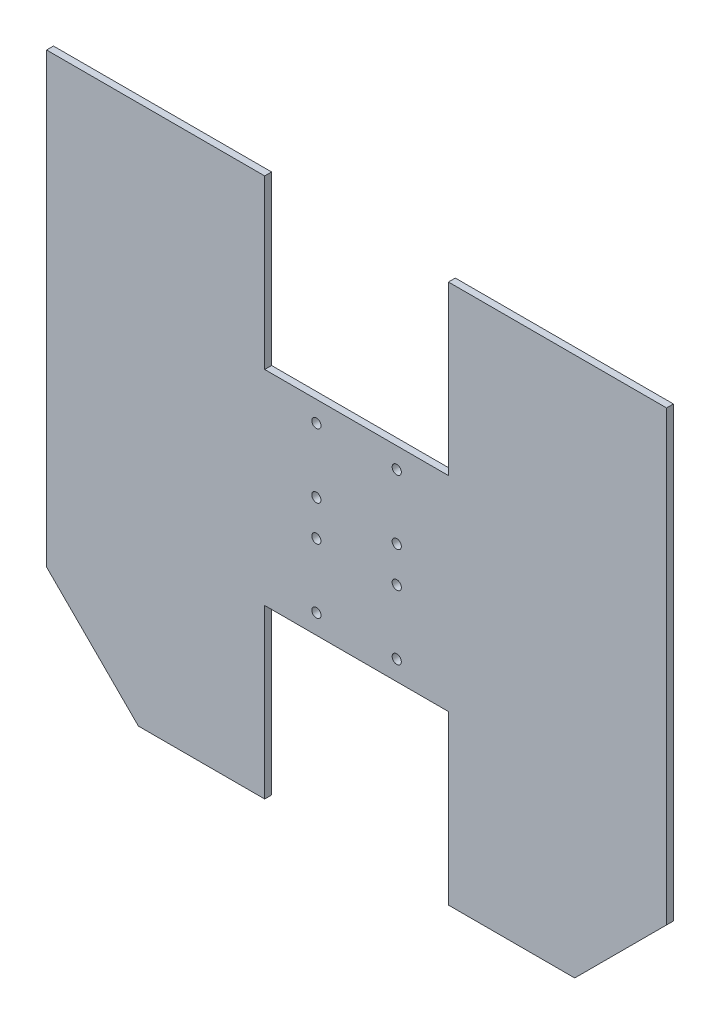
ISO-10303-21;
HEADER;
FILE_DESCRIPTION(('STEP AP214'),'2;1');
FILE_NAME('part.step','',(''),(''),'','','');
FILE_SCHEMA(('AUTOMOTIVE_DESIGN { 1 0 10303 214 1 1 1 1 }'));
ENDSEC;
DATA;
#1=APPLICATION_CONTEXT('core data for automotive mechanical design processes');
#2=APPLICATION_PROTOCOL_DEFINITION('international standard','automotive_design',2000,#1);
#3=PRODUCT_CONTEXT('',#1,'mechanical');
#4=PRODUCT('Part','Part','',(#3));
#5=PRODUCT_RELATED_PRODUCT_CATEGORY('part','',(#4));
#6=PRODUCT_DEFINITION_FORMATION('','',#4);
#7=PRODUCT_DEFINITION_CONTEXT('part definition',#1,'design');
#8=PRODUCT_DEFINITION('design','',#6,#7);
#9=PRODUCT_DEFINITION_SHAPE('','',#8);
#10=(LENGTH_UNIT() NAMED_UNIT(*) SI_UNIT(.MILLI.,.METRE.));
#11=(NAMED_UNIT(*) PLANE_ANGLE_UNIT() SI_UNIT($,.RADIAN.));
#12=(NAMED_UNIT(*) SI_UNIT($,.STERADIAN.) SOLID_ANGLE_UNIT());
#13=UNCERTAINTY_MEASURE_WITH_UNIT(LENGTH_MEASURE(1.E-05),#10,'distance_accuracy_value','');
#14=(GEOMETRIC_REPRESENTATION_CONTEXT(3) GLOBAL_UNCERTAINTY_ASSIGNED_CONTEXT((#13)) GLOBAL_UNIT_ASSIGNED_CONTEXT((#10,
#11,#12)) REPRESENTATION_CONTEXT('',''));
#15=CARTESIAN_POINT('',(0.,0.,0.));
#16=DIRECTION('',(0.,0.,1.));
#17=DIRECTION('',(1.,0.,0.));
#18=AXIS2_PLACEMENT_3D('',#15,#16,#17);
#19=CARTESIAN_POINT('',(-135.,117.5,3.));
#20=DIRECTION('',(0.,-1.,0.));
#21=DIRECTION('',(1.,0.,0.));
#22=AXIS2_PLACEMENT_3D('',#19,#20,#21);
#23=PLANE('',#22);
#24=DIRECTION('',(-1.,0.,0.));
#25=VECTOR('',#24,1.);
#26=CARTESIAN_POINT('',(-135.,117.5,0.));
#27=LINE('',#26,#25);
#28=CARTESIAN_POINT('',(-40.0000000000001,117.5,0.));
#29=VERTEX_POINT('',#28);
#30=CARTESIAN_POINT('',(-135.,117.5,0.));
#31=VERTEX_POINT('',#30);
#32=EDGE_CURVE('E154',#29,#31,#27,.T.);
#33=ORIENTED_EDGE('',*,*,#32,.T.);
#34=DIRECTION('',(0.,0.,-1.));
#35=VECTOR('',#34,1.);
#36=CARTESIAN_POINT('',(-135.,117.5,3.));
#37=LINE('',#36,#35);
#38=CARTESIAN_POINT('',(-135.,117.5,3.));
#39=VERTEX_POINT('',#38);
#40=EDGE_CURVE('E138',#39,#31,#37,.T.);
#41=ORIENTED_EDGE('',*,*,#40,.F.);
#42=DIRECTION('',(-1.,0.,0.));
#43=VECTOR('',#42,1.);
#44=CARTESIAN_POINT('',(-135.,117.5,3.));
#45=LINE('',#44,#43);
#46=CARTESIAN_POINT('',(-40.0000000000001,117.5,3.));
#47=VERTEX_POINT('',#46);
#48=EDGE_CURVE('E141',#47,#39,#45,.T.);
#49=ORIENTED_EDGE('',*,*,#48,.F.);
#50=DIRECTION('',(0.,0.,-1.));
#51=VECTOR('',#50,1.);
#52=CARTESIAN_POINT('',(-40.0000000000001,117.5,3.));
#53=LINE('',#52,#51);
#54=EDGE_CURVE('E209',#47,#29,#53,.T.);
#55=ORIENTED_EDGE('',*,*,#54,.T.);
#56=EDGE_LOOP('',(#33,#41,#49,#55));
#57=FACE_BOUND('',#56,.T.);
#58=ADVANCED_FACE('F35',(#57),#23,.F.);
#59=CARTESIAN_POINT('',(-135.,-117.5,3.));
#60=DIRECTION('',(1.,0.,0.));
#61=DIRECTION('',(0.,0.,-1.));
#62=AXIS2_PLACEMENT_3D('',#59,#60,#61);
#63=PLANE('',#62);
#64=DIRECTION('',(0.,-1.,0.));
#65=VECTOR('',#64,1.);
#66=CARTESIAN_POINT('',(-135.,-117.5,0.));
#67=LINE('',#66,#65);
#68=CARTESIAN_POINT('',(-135.,-77.4999999999998,0.));
#69=VERTEX_POINT('',#68);
#70=EDGE_CURVE('E187',#31,#69,#67,.T.);
#71=ORIENTED_EDGE('',*,*,#70,.T.);
#72=DIRECTION('',(0.,0.,1.));
#73=VECTOR('',#72,1.);
#74=CARTESIAN_POINT('',(-135.,-77.4999999999998,3.));
#75=LINE('',#74,#73);
#76=CARTESIAN_POINT('',(-135.,-77.4999999999998,3.));
#77=VERTEX_POINT('',#76);
#78=EDGE_CURVE('E11',#69,#77,#75,.T.);
#79=ORIENTED_EDGE('',*,*,#78,.T.);
#80=DIRECTION('',(0.,-1.,0.));
#81=VECTOR('',#80,1.);
#82=CARTESIAN_POINT('',(-135.,-117.5,3.));
#83=LINE('',#82,#81);
#84=EDGE_CURVE('E134',#39,#77,#83,.T.);
#85=ORIENTED_EDGE('',*,*,#84,.F.);
#86=ORIENTED_EDGE('',*,*,#40,.T.);
#87=EDGE_LOOP('',(#71,#79,#85,#86));
#88=FACE_BOUND('',#87,.T.);
#89=ADVANCED_FACE('F136',(#88),#63,.F.);
#90=CARTESIAN_POINT('',(-40.0000000000001,-117.5,3.));
#91=DIRECTION('',(0.,1.,0.));
#92=DIRECTION('',(-1.,0.,0.));
#93=AXIS2_PLACEMENT_3D('',#90,#91,#92);
#94=PLANE('',#93);
#95=DIRECTION('',(1.,0.,0.));
#96=VECTOR('',#95,1.);
#97=CARTESIAN_POINT('',(-40.0000000000001,-117.5,3.));
#98=LINE('',#97,#96);
#99=CARTESIAN_POINT('',(-95.,-117.5,3.));
#100=VERTEX_POINT('',#99);
#101=CARTESIAN_POINT('',(-40.0000000000001,-117.5,3.));
#102=VERTEX_POINT('',#101);
#103=EDGE_CURVE('E140',#100,#102,#98,.T.);
#104=ORIENTED_EDGE('',*,*,#103,.F.);
#105=DIRECTION('',(0.,0.,-1.));
#106=VECTOR('',#105,1.);
#107=CARTESIAN_POINT('',(-95.,-117.5,3.));
#108=LINE('',#107,#106);
#109=CARTESIAN_POINT('',(-95.,-117.5,0.));
#110=VERTEX_POINT('',#109);
#111=EDGE_CURVE('E44',#100,#110,#108,.T.);
#112=ORIENTED_EDGE('',*,*,#111,.T.);
#113=DIRECTION('',(1.,0.,0.));
#114=VECTOR('',#113,1.);
#115=CARTESIAN_POINT('',(-40.0000000000001,-117.5,0.));
#116=LINE('',#115,#114);
#117=CARTESIAN_POINT('',(-40.0000000000001,-117.5,0.));
#118=VERTEX_POINT('',#117);
#119=EDGE_CURVE('E179',#110,#118,#116,.T.);
#120=ORIENTED_EDGE('',*,*,#119,.T.);
#121=DIRECTION('',(0.,0.,-1.));
#122=VECTOR('',#121,1.);
#123=CARTESIAN_POINT('',(-40.0000000000001,-117.5,3.));
#124=LINE('',#123,#122);
#125=EDGE_CURVE('E156',#102,#118,#124,.T.);
#126=ORIENTED_EDGE('',*,*,#125,.F.);
#127=EDGE_LOOP('',(#104,#112,#120,#126));
#128=FACE_BOUND('',#127,.T.);
#129=ADVANCED_FACE('F177',(#128),#94,.F.);
#130=CARTESIAN_POINT('',(-40.0000000000001,-117.5,3.));
#131=DIRECTION('',(-1.,0.,0.));
#132=DIRECTION('',(0.,-1.,0.));
#133=AXIS2_PLACEMENT_3D('',#130,#131,#132);
#134=PLANE('',#133);
#135=DIRECTION('',(0.,1.,0.));
#136=VECTOR('',#135,1.);
#137=CARTESIAN_POINT('',(-40.0000000000001,-117.5,0.));
#138=LINE('',#137,#136);
#139=CARTESIAN_POINT('',(-39.9999999999999,-44.5,0.));
#140=VERTEX_POINT('',#139);
#141=EDGE_CURVE('E186',#118,#140,#138,.T.);
#142=ORIENTED_EDGE('',*,*,#141,.T.);
#143=DIRECTION('',(0.,0.,-1.));
#144=VECTOR('',#143,1.);
#145=CARTESIAN_POINT('',(-39.9999999999999,-44.5,3.));
#146=LINE('',#145,#144);
#147=CARTESIAN_POINT('',(-39.9999999999999,-44.5,3.));
#148=VERTEX_POINT('',#147);
#149=EDGE_CURVE('E162',#148,#140,#146,.T.);
#150=ORIENTED_EDGE('',*,*,#149,.F.);
#151=DIRECTION('',(0.,1.,0.));
#152=VECTOR('',#151,1.);
#153=CARTESIAN_POINT('',(-40.0000000000001,-117.5,3.));
#154=LINE('',#153,#152);
#155=EDGE_CURVE('E276',#102,#148,#154,.T.);
#156=ORIENTED_EDGE('',*,*,#155,.F.);
#157=ORIENTED_EDGE('',*,*,#125,.T.);
#158=EDGE_LOOP('',(#142,#150,#156,#157));
#159=FACE_BOUND('',#158,.T.);
#160=ADVANCED_FACE('F277',(#159),#134,.F.);
#161=CARTESIAN_POINT('',(-39.9999999999999,-44.5,3.));
#162=DIRECTION('',(0.,1.,0.));
#163=DIRECTION('',(0.,0.,1.));
#164=AXIS2_PLACEMENT_3D('',#161,#162,#163);
#165=PLANE('',#164);
#166=DIRECTION('',(1.,0.,0.));
#167=VECTOR('',#166,1.);
#168=CARTESIAN_POINT('',(-39.9999999999999,-44.5,0.));
#169=LINE('',#168,#167);
#170=CARTESIAN_POINT('',(39.9999999999999,-44.5,0.));
#171=VERTEX_POINT('',#170);
#172=EDGE_CURVE('E189',#140,#171,#169,.T.);
#173=ORIENTED_EDGE('',*,*,#172,.T.);
#174=DIRECTION('',(0.,0.,-1.));
#175=VECTOR('',#174,1.);
#176=CARTESIAN_POINT('',(39.9999999999999,-44.5,3.));
#177=LINE('',#176,#175);
#178=CARTESIAN_POINT('',(39.9999999999999,-44.5,3.));
#179=VERTEX_POINT('',#178);
#180=EDGE_CURVE('E226',#179,#171,#177,.T.);
#181=ORIENTED_EDGE('',*,*,#180,.F.);
#182=DIRECTION('',(1.,0.,0.));
#183=VECTOR('',#182,1.);
#184=CARTESIAN_POINT('',(-39.9999999999999,-44.5,3.));
#185=LINE('',#184,#183);
#186=EDGE_CURVE('E234',#148,#179,#185,.T.);
#187=ORIENTED_EDGE('',*,*,#186,.F.);
#188=ORIENTED_EDGE('',*,*,#149,.T.);
#189=EDGE_LOOP('',(#173,#181,#187,#188));
#190=FACE_BOUND('',#189,.T.);
#191=ADVANCED_FACE('F232',(#190),#165,.F.);
#192=CARTESIAN_POINT('',(39.9999999999999,-44.5,3.));
#193=DIRECTION('',(1.,0.,0.));
#194=DIRECTION('',(0.,1.,0.));
#195=AXIS2_PLACEMENT_3D('',#192,#193,#194);
#196=PLANE('',#195);
#197=DIRECTION('',(0.,-1.,0.));
#198=VECTOR('',#197,1.);
#199=CARTESIAN_POINT('',(39.9999999999999,-44.5,0.));
#200=LINE('',#199,#198);
#201=CARTESIAN_POINT('',(40.0000000000001,-117.5,0.));
#202=VERTEX_POINT('',#201);
#203=EDGE_CURVE('E195',#171,#202,#200,.T.);
#204=ORIENTED_EDGE('',*,*,#203,.T.);
#205=DIRECTION('',(0.,0.,-1.));
#206=VECTOR('',#205,1.);
#207=CARTESIAN_POINT('',(40.0000000000001,-117.5,3.));
#208=LINE('',#207,#206);
#209=CARTESIAN_POINT('',(40.0000000000001,-117.5,3.));
#210=VERTEX_POINT('',#209);
#211=EDGE_CURVE('E223',#210,#202,#208,.T.);
#212=ORIENTED_EDGE('',*,*,#211,.F.);
#213=DIRECTION('',(0.,-1.,0.));
#214=VECTOR('',#213,1.);
#215=CARTESIAN_POINT('',(39.9999999999999,-44.5,3.));
#216=LINE('',#215,#214);
#217=EDGE_CURVE('E250',#179,#210,#216,.T.);
#218=ORIENTED_EDGE('',*,*,#217,.F.);
#219=ORIENTED_EDGE('',*,*,#180,.T.);
#220=EDGE_LOOP('',(#204,#212,#218,#219));
#221=FACE_BOUND('',#220,.T.);
#222=ADVANCED_FACE('F241',(#221),#196,.F.);
#223=CARTESIAN_POINT('',(135.,-117.5,3.));
#224=DIRECTION('',(0.,1.,0.));
#225=DIRECTION('',(-1.,0.,0.));
#226=AXIS2_PLACEMENT_3D('',#223,#224,#225);
#227=PLANE('',#226);
#228=DIRECTION('',(1.,0.,0.));
#229=VECTOR('',#228,1.);
#230=CARTESIAN_POINT('',(135.,-117.5,0.));
#231=LINE('',#230,#229);
#232=CARTESIAN_POINT('',(94.9999999999997,-117.5,0.));
#233=VERTEX_POINT('',#232);
#234=EDGE_CURVE('E197',#202,#233,#231,.T.);
#235=ORIENTED_EDGE('',*,*,#234,.T.);
#236=DIRECTION('',(0.,0.,1.));
#237=VECTOR('',#236,1.);
#238=CARTESIAN_POINT('',(94.9999999999997,-117.5,3.));
#239=LINE('',#238,#237);
#240=CARTESIAN_POINT('',(94.9999999999997,-117.5,3.));
#241=VERTEX_POINT('',#240);
#242=EDGE_CURVE('E169',#233,#241,#239,.T.);
#243=ORIENTED_EDGE('',*,*,#242,.T.);
#244=DIRECTION('',(1.,0.,0.));
#245=VECTOR('',#244,1.);
#246=CARTESIAN_POINT('',(135.,-117.5,3.));
#247=LINE('',#246,#245);
#248=EDGE_CURVE('E247',#210,#241,#247,.T.);
#249=ORIENTED_EDGE('',*,*,#248,.F.);
#250=ORIENTED_EDGE('',*,*,#211,.T.);
#251=EDGE_LOOP('',(#235,#243,#249,#250));
#252=FACE_BOUND('',#251,.T.);
#253=ADVANCED_FACE('F245',(#252),#227,.F.);
#254=CARTESIAN_POINT('',(135.,-117.5,3.));
#255=DIRECTION('',(-1.,0.,0.));
#256=DIRECTION('',(0.,0.,1.));
#257=AXIS2_PLACEMENT_3D('',#254,#255,#256);
#258=PLANE('',#257);
#259=DIRECTION('',(0.,1.,0.));
#260=VECTOR('',#259,1.);
#261=CARTESIAN_POINT('',(135.,-117.5,3.));
#262=LINE('',#261,#260);
#263=CARTESIAN_POINT('',(135.,-77.4999999999999,3.));
#264=VERTEX_POINT('',#263);
#265=CARTESIAN_POINT('',(135.,117.5,3.));
#266=VERTEX_POINT('',#265);
#267=EDGE_CURVE('E249',#264,#266,#262,.T.);
#268=ORIENTED_EDGE('',*,*,#267,.F.);
#269=DIRECTION('',(0.,0.,-1.));
#270=VECTOR('',#269,1.);
#271=CARTESIAN_POINT('',(135.,-77.4999999999998,3.));
#272=LINE('',#271,#270);
#273=CARTESIAN_POINT('',(135.,-77.4999999999999,0.));
#274=VERTEX_POINT('',#273);
#275=EDGE_CURVE('E155',#264,#274,#272,.T.);
#276=ORIENTED_EDGE('',*,*,#275,.T.);
#277=DIRECTION('',(0.,1.,0.));
#278=VECTOR('',#277,1.);
#279=CARTESIAN_POINT('',(135.,-117.5,0.));
#280=LINE('',#279,#278);
#281=CARTESIAN_POINT('',(135.,117.5,0.));
#282=VERTEX_POINT('',#281);
#283=EDGE_CURVE('E200',#274,#282,#280,.T.);
#284=ORIENTED_EDGE('',*,*,#283,.T.);
#285=DIRECTION('',(0.,0.,-1.));
#286=VECTOR('',#285,1.);
#287=CARTESIAN_POINT('',(135.,117.5,3.));
#288=LINE('',#287,#286);
#289=EDGE_CURVE('E220',#266,#282,#288,.T.);
#290=ORIENTED_EDGE('',*,*,#289,.F.);
#291=EDGE_LOOP('',(#268,#276,#284,#290));
#292=FACE_BOUND('',#291,.T.);
#293=ADVANCED_FACE('F310',(#292),#258,.F.);
#294=CARTESIAN_POINT('',(135.,117.5,3.));
#295=DIRECTION('',(0.,-1.,0.));
#296=DIRECTION('',(1.,0.,0.));
#297=AXIS2_PLACEMENT_3D('',#294,#295,#296);
#298=PLANE('',#297);
#299=DIRECTION('',(-1.,0.,0.));
#300=VECTOR('',#299,1.);
#301=CARTESIAN_POINT('',(135.,117.5,0.));
#302=LINE('',#301,#300);
#303=CARTESIAN_POINT('',(40.0000000000001,117.5,0.));
#304=VERTEX_POINT('',#303);
#305=EDGE_CURVE('E202',#282,#304,#302,.T.);
#306=ORIENTED_EDGE('',*,*,#305,.T.);
#307=DIRECTION('',(0.,0.,-1.));
#308=VECTOR('',#307,1.);
#309=CARTESIAN_POINT('',(40.0000000000001,117.5,3.));
#310=LINE('',#309,#308);
#311=CARTESIAN_POINT('',(40.0000000000001,117.5,3.));
#312=VERTEX_POINT('',#311);
#313=EDGE_CURVE('E217',#312,#304,#310,.T.);
#314=ORIENTED_EDGE('',*,*,#313,.F.);
#315=DIRECTION('',(-1.,0.,0.));
#316=VECTOR('',#315,1.);
#317=CARTESIAN_POINT('',(135.,117.5,3.));
#318=LINE('',#317,#316);
#319=EDGE_CURVE('E252',#266,#312,#318,.T.);
#320=ORIENTED_EDGE('',*,*,#319,.F.);
#321=ORIENTED_EDGE('',*,*,#289,.T.);
#322=EDGE_LOOP('',(#306,#314,#320,#321));
#323=FACE_BOUND('',#322,.T.);
#324=ADVANCED_FACE('F315',(#323),#298,.F.);
#325=CARTESIAN_POINT('',(40.0000000000001,44.5,3.));
#326=DIRECTION('',(1.,0.,0.));
#327=DIRECTION('',(0.,1.,0.));
#328=AXIS2_PLACEMENT_3D('',#325,#326,#327);
#329=PLANE('',#328);
#330=DIRECTION('',(0.,-1.,0.));
#331=VECTOR('',#330,1.);
#332=CARTESIAN_POINT('',(40.0000000000001,44.5,0.));
#333=LINE('',#332,#331);
#334=CARTESIAN_POINT('',(40.0000000000001,44.5,0.));
#335=VERTEX_POINT('',#334);
#336=EDGE_CURVE('E204',#304,#335,#333,.T.);
#337=ORIENTED_EDGE('',*,*,#336,.T.);
#338=DIRECTION('',(0.,0.,-1.));
#339=VECTOR('',#338,1.);
#340=CARTESIAN_POINT('',(40.0000000000001,44.5,3.));
#341=LINE('',#340,#339);
#342=CARTESIAN_POINT('',(40.0000000000001,44.5,3.));
#343=VERTEX_POINT('',#342);
#344=EDGE_CURVE('E214',#343,#335,#341,.T.);
#345=ORIENTED_EDGE('',*,*,#344,.F.);
#346=DIRECTION('',(0.,-1.,0.));
#347=VECTOR('',#346,1.);
#348=CARTESIAN_POINT('',(40.0000000000001,44.5,3.));
#349=LINE('',#348,#347);
#350=EDGE_CURVE('E258',#312,#343,#349,.T.);
#351=ORIENTED_EDGE('',*,*,#350,.F.);
#352=ORIENTED_EDGE('',*,*,#313,.T.);
#353=EDGE_LOOP('',(#337,#345,#351,#352));
#354=FACE_BOUND('',#353,.T.);
#355=ADVANCED_FACE('F321',(#354),#329,.F.);
#356=CARTESIAN_POINT('',(-39.9999999999999,44.5,3.));
#357=DIRECTION('',(0.,-1.,0.));
#358=DIRECTION('',(1.,0.,0.));
#359=AXIS2_PLACEMENT_3D('',#356,#357,#358);
#360=PLANE('',#359);
#361=DIRECTION('',(-1.,0.,0.));
#362=VECTOR('',#361,1.);
#363=CARTESIAN_POINT('',(-39.9999999999999,44.5,0.));
#364=LINE('',#363,#362);
#365=CARTESIAN_POINT('',(-39.9999999999999,44.5,0.));
#366=VERTEX_POINT('',#365);
#367=EDGE_CURVE('E206',#335,#366,#364,.T.);
#368=ORIENTED_EDGE('',*,*,#367,.T.);
#369=DIRECTION('',(0.,0.,-1.));
#370=VECTOR('',#369,1.);
#371=CARTESIAN_POINT('',(-39.9999999999999,44.5,3.));
#372=LINE('',#371,#370);
#373=CARTESIAN_POINT('',(-39.9999999999999,44.5,3.));
#374=VERTEX_POINT('',#373);
#375=EDGE_CURVE('E211',#374,#366,#372,.T.);
#376=ORIENTED_EDGE('',*,*,#375,.F.);
#377=DIRECTION('',(-1.,0.,0.));
#378=VECTOR('',#377,1.);
#379=CARTESIAN_POINT('',(-39.9999999999999,44.5,3.));
#380=LINE('',#379,#378);
#381=EDGE_CURVE('E260',#343,#374,#380,.T.);
#382=ORIENTED_EDGE('',*,*,#381,.F.);
#383=ORIENTED_EDGE('',*,*,#344,.T.);
#384=EDGE_LOOP('',(#368,#376,#382,#383));
#385=FACE_BOUND('',#384,.T.);
#386=ADVANCED_FACE('F325',(#385),#360,.F.);
#387=CARTESIAN_POINT('',(-40.0000000000001,117.5,3.));
#388=DIRECTION('',(-1.,0.,0.));
#389=DIRECTION('',(0.,-1.,0.));
#390=AXIS2_PLACEMENT_3D('',#387,#388,#389);
#391=PLANE('',#390);
#392=DIRECTION('',(0.,1.,0.));
#393=VECTOR('',#392,1.);
#394=CARTESIAN_POINT('',(-40.0000000000001,117.5,0.));
#395=LINE('',#394,#393);
#396=EDGE_CURVE('E151',#366,#29,#395,.T.);
#397=ORIENTED_EDGE('',*,*,#396,.T.);
#398=ORIENTED_EDGE('',*,*,#54,.F.);
#399=DIRECTION('',(0.,1.,0.));
#400=VECTOR('',#399,1.);
#401=CARTESIAN_POINT('',(-40.0000000000001,117.5,3.));
#402=LINE('',#401,#400);
#403=EDGE_CURVE('E147',#374,#47,#402,.T.);
#404=ORIENTED_EDGE('',*,*,#403,.F.);
#405=ORIENTED_EDGE('',*,*,#375,.T.);
#406=EDGE_LOOP('',(#397,#398,#404,#405));
#407=FACE_BOUND('',#406,.T.);
#408=ADVANCED_FACE('F328',(#407),#391,.F.);
#409=CARTESIAN_POINT('',(0.,0.,3.));
#410=DIRECTION('',(0.,0.,-1.));
#411=DIRECTION('',(-1.,0.,0.));
#412=AXIS2_PLACEMENT_3D('',#409,#410,#411);
#413=PLANE('',#412);
#414=CARTESIAN_POINT('',(17.5,-35.98,3.));
#415=DIRECTION('',(0.,0.,1.));
#416=DIRECTION('',(1.,0.,0.));
#417=AXIS2_PLACEMENT_3D('',#414,#415,#416);
#418=CIRCLE('',#417,1.99999999997649);
#419=CARTESIAN_POINT('',(19.4999999999765,-35.98,3.));
#420=VERTEX_POINT('',#419);
#421=EDGE_CURVE('E554',#420,#420,#418,.T.);
#422=ORIENTED_EDGE('',*,*,#421,.F.);
#423=EDGE_LOOP('',(#422));
#424=FACE_BOUND('',#423,.T.);
#425=CARTESIAN_POINT('',(-17.5,-7.98000000000004,3.));
#426=DIRECTION('',(0.,0.,1.));
#427=DIRECTION('',(1.,0.,0.));
#428=AXIS2_PLACEMENT_3D('',#425,#426,#427);
#429=CIRCLE('',#428,1.99999999997679);
#430=CARTESIAN_POINT('',(-15.5000000000232,-7.98000000000004,3.));
#431=VERTEX_POINT('',#430);
#432=EDGE_CURVE('E558',#431,#431,#429,.T.);
#433=ORIENTED_EDGE('',*,*,#432,.F.);
#434=EDGE_LOOP('',(#433));
#435=FACE_BOUND('',#434,.T.);
#436=CARTESIAN_POINT('',(-17.5,7.5,3.));
#437=DIRECTION('',(0.,0.,1.));
#438=DIRECTION('',(1.,0.,0.));
#439=AXIS2_PLACEMENT_3D('',#436,#437,#438);
#440=CIRCLE('',#439,2.00000000000145);
#441=CARTESIAN_POINT('',(-15.4999999999986,7.5,3.));
#442=VERTEX_POINT('',#441);
#443=EDGE_CURVE('E562',#442,#442,#440,.T.);
#444=ORIENTED_EDGE('',*,*,#443,.F.);
#445=EDGE_LOOP('',(#444));
#446=FACE_BOUND('',#445,.T.);
#447=CARTESIAN_POINT('',(17.5,7.50000000000001,3.));
#448=DIRECTION('',(0.,0.,1.));
#449=DIRECTION('',(1.,0.,0.));
#450=AXIS2_PLACEMENT_3D('',#447,#448,#449);
#451=CIRCLE('',#450,2.00000000000144);
#452=CARTESIAN_POINT('',(19.5000000000014,7.50000000000001,3.));
#453=VERTEX_POINT('',#452);
#454=EDGE_CURVE('E272',#453,#453,#451,.T.);
#455=ORIENTED_EDGE('',*,*,#454,.F.);
#456=EDGE_LOOP('',(#455));
#457=FACE_BOUND('',#456,.T.);
#458=CARTESIAN_POINT('',(17.5,35.5,3.));
#459=DIRECTION('',(0.,0.,1.));
#460=DIRECTION('',(1.,0.,0.));
#461=AXIS2_PLACEMENT_3D('',#458,#459,#460);
#462=CIRCLE('',#461,2.00000000000126);
#463=CARTESIAN_POINT('',(19.5000000000013,35.5,3.));
#464=VERTEX_POINT('',#463);
#465=EDGE_CURVE('E546',#464,#464,#462,.T.);
#466=ORIENTED_EDGE('',*,*,#465,.F.);
#467=EDGE_LOOP('',(#466));
#468=FACE_BOUND('',#467,.T.);
#469=CARTESIAN_POINT('',(-17.5,35.5,3.));
#470=DIRECTION('',(0.,0.,1.));
#471=DIRECTION('',(1.,0.,0.));
#472=AXIS2_PLACEMENT_3D('',#469,#470,#471);
#473=CIRCLE('',#472,2.);
#474=CARTESIAN_POINT('',(-15.5,35.5,3.));
#475=VERTEX_POINT('',#474);
#476=EDGE_CURVE('E550',#475,#475,#473,.T.);
#477=ORIENTED_EDGE('',*,*,#476,.F.);
#478=EDGE_LOOP('',(#477));
#479=FACE_BOUND('',#478,.T.);
#480=CARTESIAN_POINT('',(17.5,-7.98000000000005,3.));
#481=DIRECTION('',(0.,0.,1.));
#482=DIRECTION('',(1.,0.,0.));
#483=AXIS2_PLACEMENT_3D('',#480,#481,#482);
#484=CIRCLE('',#483,1.99999999997679);
#485=CARTESIAN_POINT('',(19.4999999999768,-7.98000000000005,3.));
#486=VERTEX_POINT('',#485);
#487=EDGE_CURVE('E540',#486,#486,#484,.T.);
#488=ORIENTED_EDGE('',*,*,#487,.F.);
#489=EDGE_LOOP('',(#488));
#490=FACE_BOUND('',#489,.T.);
#491=CARTESIAN_POINT('',(-17.5,-35.98,3.));
#492=DIRECTION('',(0.,0.,1.));
#493=DIRECTION('',(1.,0.,0.));
#494=AXIS2_PLACEMENT_3D('',#491,#492,#493);
#495=CIRCLE('',#494,1.99999999997649);
#496=CARTESIAN_POINT('',(-15.5000000000235,-35.98,3.));
#497=VERTEX_POINT('',#496);
#498=EDGE_CURVE('E264',#497,#497,#495,.T.);
#499=ORIENTED_EDGE('',*,*,#498,.F.);
#500=EDGE_LOOP('',(#499));
#501=FACE_BOUND('',#500,.T.);
#502=ORIENTED_EDGE('',*,*,#248,.T.);
#503=DIRECTION('',(-0.707106781186549,-0.707106781186547,0.));
#504=VECTOR('',#503,1.);
#505=CARTESIAN_POINT('',(135.,-77.4999999999998,3.));
#506=LINE('',#505,#504);
#507=EDGE_CURVE('E172',#241,#264,#506,.F.);
#508=ORIENTED_EDGE('',*,*,#507,.T.);
#509=ORIENTED_EDGE('',*,*,#267,.T.);
#510=ORIENTED_EDGE('',*,*,#319,.T.);
#511=ORIENTED_EDGE('',*,*,#350,.T.);
#512=ORIENTED_EDGE('',*,*,#381,.T.);
#513=ORIENTED_EDGE('',*,*,#403,.T.);
#514=ORIENTED_EDGE('',*,*,#48,.T.);
#515=ORIENTED_EDGE('',*,*,#84,.T.);
#516=DIRECTION('',(-0.707106781186547,0.707106781186549,0.));
#517=VECTOR('',#516,1.);
#518=CARTESIAN_POINT('',(-95.,-117.5,3.));
#519=LINE('',#518,#517);
#520=EDGE_CURVE('E51',#77,#100,#519,.F.);
#521=ORIENTED_EDGE('',*,*,#520,.T.);
#522=ORIENTED_EDGE('',*,*,#103,.T.);
#523=ORIENTED_EDGE('',*,*,#155,.T.);
#524=ORIENTED_EDGE('',*,*,#186,.T.);
#525=ORIENTED_EDGE('',*,*,#217,.T.);
#526=EDGE_LOOP('',(#502,#508,#509,#510,#511,#512,#513,#514,#515,#521,#522,#523,#524,#525));
#527=FACE_BOUND('',#526,.T.);
#528=ADVANCED_FACE('F145',(#424,#435,#446,#457,#468,#479,#490,#501,#527),#413,.F.);
#529=CARTESIAN_POINT('',(0.,0.,0.));
#530=DIRECTION('',(0.,0.,-1.));
#531=DIRECTION('',(-1.,0.,0.));
#532=AXIS2_PLACEMENT_3D('',#529,#530,#531);
#533=PLANE('',#532);
#534=CARTESIAN_POINT('',(17.5,-35.98,0.));
#535=DIRECTION('',(0.,0.,1.));
#536=DIRECTION('',(1.,0.,0.));
#537=AXIS2_PLACEMENT_3D('',#534,#535,#536);
#538=CIRCLE('',#537,1.99999999997649);
#539=CARTESIAN_POINT('',(19.4999999999765,-35.98,0.));
#540=VERTEX_POINT('',#539);
#541=EDGE_CURVE('E269',#540,#540,#538,.T.);
#542=ORIENTED_EDGE('',*,*,#541,.T.);
#543=EDGE_LOOP('',(#542));
#544=FACE_BOUND('',#543,.T.);
#545=CARTESIAN_POINT('',(-17.5,-7.98000000000004,0.));
#546=DIRECTION('',(0.,0.,1.));
#547=DIRECTION('',(1.,0.,0.));
#548=AXIS2_PLACEMENT_3D('',#545,#546,#547);
#549=CIRCLE('',#548,1.99999999997679);
#550=CARTESIAN_POINT('',(-15.5000000000232,-7.98000000000004,0.));
#551=VERTEX_POINT('',#550);
#552=EDGE_CURVE('E520',#551,#551,#549,.T.);
#553=ORIENTED_EDGE('',*,*,#552,.T.);
#554=EDGE_LOOP('',(#553));
#555=FACE_BOUND('',#554,.T.);
#556=CARTESIAN_POINT('',(-17.5,7.5,0.));
#557=DIRECTION('',(0.,0.,1.));
#558=DIRECTION('',(1.,0.,0.));
#559=AXIS2_PLACEMENT_3D('',#556,#557,#558);
#560=CIRCLE('',#559,2.00000000000145);
#561=CARTESIAN_POINT('',(-15.4999999999986,7.5,0.));
#562=VERTEX_POINT('',#561);
#563=EDGE_CURVE('E524',#562,#562,#560,.T.);
#564=ORIENTED_EDGE('',*,*,#563,.T.);
#565=EDGE_LOOP('',(#564));
#566=FACE_BOUND('',#565,.T.);
#567=CARTESIAN_POINT('',(17.5,7.50000000000001,0.));
#568=DIRECTION('',(0.,0.,1.));
#569=DIRECTION('',(1.,0.,0.));
#570=AXIS2_PLACEMENT_3D('',#567,#568,#569);
#571=CIRCLE('',#570,2.00000000000144);
#572=CARTESIAN_POINT('',(19.5000000000014,7.50000000000001,0.));
#573=VERTEX_POINT('',#572);
#574=EDGE_CURVE('E528',#573,#573,#571,.T.);
#575=ORIENTED_EDGE('',*,*,#574,.T.);
#576=EDGE_LOOP('',(#575));
#577=FACE_BOUND('',#576,.T.);
#578=CARTESIAN_POINT('',(17.5,35.5,0.));
#579=DIRECTION('',(0.,0.,1.));
#580=DIRECTION('',(1.,0.,0.));
#581=AXIS2_PLACEMENT_3D('',#578,#579,#580);
#582=CIRCLE('',#581,2.00000000000126);
#583=CARTESIAN_POINT('',(19.5000000000013,35.5,0.));
#584=VERTEX_POINT('',#583);
#585=EDGE_CURVE('E532',#584,#584,#582,.T.);
#586=ORIENTED_EDGE('',*,*,#585,.T.);
#587=EDGE_LOOP('',(#586));
#588=FACE_BOUND('',#587,.T.);
#589=CARTESIAN_POINT('',(-17.5,35.5,0.));
#590=DIRECTION('',(0.,0.,1.));
#591=DIRECTION('',(1.,0.,0.));
#592=AXIS2_PLACEMENT_3D('',#589,#590,#591);
#593=CIRCLE('',#592,2.);
#594=CARTESIAN_POINT('',(-15.5,35.5,0.));
#595=VERTEX_POINT('',#594);
#596=EDGE_CURVE('E536',#595,#595,#593,.T.);
#597=ORIENTED_EDGE('',*,*,#596,.T.);
#598=EDGE_LOOP('',(#597));
#599=FACE_BOUND('',#598,.T.);
#600=CARTESIAN_POINT('',(17.5,-7.98000000000005,0.));
#601=DIRECTION('',(0.,0.,1.));
#602=DIRECTION('',(1.,0.,0.));
#603=AXIS2_PLACEMENT_3D('',#600,#601,#602);
#604=CIRCLE('',#603,1.99999999997679);
#605=CARTESIAN_POINT('',(19.4999999999768,-7.98000000000005,0.));
#606=VERTEX_POINT('',#605);
#607=EDGE_CURVE('E539',#606,#606,#604,.T.);
#608=ORIENTED_EDGE('',*,*,#607,.T.);
#609=EDGE_LOOP('',(#608));
#610=FACE_BOUND('',#609,.T.);
#611=CARTESIAN_POINT('',(-17.5,-35.98,0.));
#612=DIRECTION('',(0.,0.,1.));
#613=DIRECTION('',(1.,0.,0.));
#614=AXIS2_PLACEMENT_3D('',#611,#612,#613);
#615=CIRCLE('',#614,1.99999999997649);
#616=CARTESIAN_POINT('',(-15.5000000000235,-35.98,0.));
#617=VERTEX_POINT('',#616);
#618=EDGE_CURVE('E262',#617,#617,#615,.T.);
#619=ORIENTED_EDGE('',*,*,#618,.T.);
#620=EDGE_LOOP('',(#619));
#621=FACE_BOUND('',#620,.T.);
#622=ORIENTED_EDGE('',*,*,#283,.F.);
#623=DIRECTION('',(0.707106781186549,0.707106781186547,0.));
#624=VECTOR('',#623,1.);
#625=CARTESIAN_POINT('',(106.25,-106.25,0.));
#626=LINE('',#625,#624);
#627=EDGE_CURVE('E167',#274,#233,#626,.F.);
#628=ORIENTED_EDGE('',*,*,#627,.T.);
#629=ORIENTED_EDGE('',*,*,#234,.F.);
#630=ORIENTED_EDGE('',*,*,#203,.F.);
#631=ORIENTED_EDGE('',*,*,#172,.F.);
#632=ORIENTED_EDGE('',*,*,#141,.F.);
#633=ORIENTED_EDGE('',*,*,#119,.F.);
#634=DIRECTION('',(0.707106781186547,-0.707106781186549,0.));
#635=VECTOR('',#634,1.);
#636=CARTESIAN_POINT('',(-106.25,-106.25,0.));
#637=LINE('',#636,#635);
#638=EDGE_CURVE('E159',#110,#69,#637,.F.);
#639=ORIENTED_EDGE('',*,*,#638,.T.);
#640=ORIENTED_EDGE('',*,*,#70,.F.);
#641=ORIENTED_EDGE('',*,*,#32,.F.);
#642=ORIENTED_EDGE('',*,*,#396,.F.);
#643=ORIENTED_EDGE('',*,*,#367,.F.);
#644=ORIENTED_EDGE('',*,*,#336,.F.);
#645=ORIENTED_EDGE('',*,*,#305,.F.);
#646=EDGE_LOOP('',(#622,#628,#629,#630,#631,#632,#633,#639,#640,#641,#642,#643,#644,#645));
#647=FACE_BOUND('',#646,.T.);
#648=ADVANCED_FACE('F184',(#544,#555,#566,#577,#588,#599,#610,#621,#647),#533,.T.);
#649=CARTESIAN_POINT('',(-17.5,-35.98,0.));
#650=DIRECTION('',(0.,0.,1.));
#651=DIRECTION('',(1.,0.,0.));
#652=AXIS2_PLACEMENT_3D('',#649,#650,#651);
#653=CYLINDRICAL_SURFACE('',#652,1.99999999997649);
#654=ORIENTED_EDGE('',*,*,#618,.F.);
#655=EDGE_LOOP('',(#654));
#656=FACE_BOUND('',#655,.T.);
#657=ORIENTED_EDGE('',*,*,#498,.T.);
#658=EDGE_LOOP('',(#657));
#659=FACE_BOUND('',#658,.T.);
#660=ADVANCED_FACE('F385',(#656,#659),#653,.F.);
#661=CARTESIAN_POINT('',(17.5,-7.98000000000005,0.));
#662=DIRECTION('',(0.,0.,1.));
#663=DIRECTION('',(1.,0.,0.));
#664=AXIS2_PLACEMENT_3D('',#661,#662,#663);
#665=CYLINDRICAL_SURFACE('',#664,1.99999999997679);
#666=ORIENTED_EDGE('',*,*,#607,.F.);
#667=EDGE_LOOP('',(#666));
#668=FACE_BOUND('',#667,.T.);
#669=ORIENTED_EDGE('',*,*,#487,.T.);
#670=EDGE_LOOP('',(#669));
#671=FACE_BOUND('',#670,.T.);
#672=ADVANCED_FACE('F390',(#668,#671),#665,.F.);
#673=CARTESIAN_POINT('',(-17.5,35.5,0.));
#674=DIRECTION('',(0.,0.,1.));
#675=DIRECTION('',(1.,0.,0.));
#676=AXIS2_PLACEMENT_3D('',#673,#674,#675);
#677=CYLINDRICAL_SURFACE('',#676,2.);
#678=ORIENTED_EDGE('',*,*,#596,.F.);
#679=EDGE_LOOP('',(#678));
#680=FACE_BOUND('',#679,.T.);
#681=ORIENTED_EDGE('',*,*,#476,.T.);
#682=EDGE_LOOP('',(#681));
#683=FACE_BOUND('',#682,.T.);
#684=ADVANCED_FACE('F402',(#680,#683),#677,.F.);
#685=CARTESIAN_POINT('',(17.5,35.5,0.));
#686=DIRECTION('',(0.,0.,1.));
#687=DIRECTION('',(1.,0.,0.));
#688=AXIS2_PLACEMENT_3D('',#685,#686,#687);
#689=CYLINDRICAL_SURFACE('',#688,2.00000000000126);
#690=ORIENTED_EDGE('',*,*,#585,.F.);
#691=EDGE_LOOP('',(#690));
#692=FACE_BOUND('',#691,.T.);
#693=ORIENTED_EDGE('',*,*,#465,.T.);
#694=EDGE_LOOP('',(#693));
#695=FACE_BOUND('',#694,.T.);
#696=ADVANCED_FACE('F412',(#692,#695),#689,.F.);
#697=CARTESIAN_POINT('',(17.5,7.50000000000001,0.));
#698=DIRECTION('',(0.,0.,1.));
#699=DIRECTION('',(1.,0.,0.));
#700=AXIS2_PLACEMENT_3D('',#697,#698,#699);
#701=CYLINDRICAL_SURFACE('',#700,2.00000000000144);
#702=ORIENTED_EDGE('',*,*,#574,.F.);
#703=EDGE_LOOP('',(#702));
#704=FACE_BOUND('',#703,.T.);
#705=ORIENTED_EDGE('',*,*,#454,.T.);
#706=EDGE_LOOP('',(#705));
#707=FACE_BOUND('',#706,.T.);
#708=ADVANCED_FACE('F422',(#704,#707),#701,.F.);
#709=CARTESIAN_POINT('',(-17.5,7.5,0.));
#710=DIRECTION('',(0.,0.,1.));
#711=DIRECTION('',(1.,0.,0.));
#712=AXIS2_PLACEMENT_3D('',#709,#710,#711);
#713=CYLINDRICAL_SURFACE('',#712,2.00000000000145);
#714=ORIENTED_EDGE('',*,*,#563,.F.);
#715=EDGE_LOOP('',(#714));
#716=FACE_BOUND('',#715,.T.);
#717=ORIENTED_EDGE('',*,*,#443,.T.);
#718=EDGE_LOOP('',(#717));
#719=FACE_BOUND('',#718,.T.);
#720=ADVANCED_FACE('F432',(#716,#719),#713,.F.);
#721=CARTESIAN_POINT('',(-17.5,-7.98000000000004,0.));
#722=DIRECTION('',(0.,0.,1.));
#723=DIRECTION('',(1.,0.,0.));
#724=AXIS2_PLACEMENT_3D('',#721,#722,#723);
#725=CYLINDRICAL_SURFACE('',#724,1.99999999997679);
#726=ORIENTED_EDGE('',*,*,#552,.F.);
#727=EDGE_LOOP('',(#726));
#728=FACE_BOUND('',#727,.T.);
#729=ORIENTED_EDGE('',*,*,#432,.T.);
#730=EDGE_LOOP('',(#729));
#731=FACE_BOUND('',#730,.T.);
#732=ADVANCED_FACE('F303',(#728,#731),#725,.F.);
#733=CARTESIAN_POINT('',(17.5,-35.98,0.));
#734=DIRECTION('',(0.,0.,1.));
#735=DIRECTION('',(1.,0.,0.));
#736=AXIS2_PLACEMENT_3D('',#733,#734,#735);
#737=CYLINDRICAL_SURFACE('',#736,1.99999999997649);
#738=ORIENTED_EDGE('',*,*,#541,.F.);
#739=EDGE_LOOP('',(#738));
#740=FACE_BOUND('',#739,.T.);
#741=ORIENTED_EDGE('',*,*,#421,.T.);
#742=EDGE_LOOP('',(#741));
#743=FACE_BOUND('',#742,.T.);
#744=ADVANCED_FACE('F297',(#740,#743),#737,.F.);
#745=CARTESIAN_POINT('',(135.,-77.4999999999998,3.));
#746=DIRECTION('',(-0.707106781186546,0.707106781186548,0.));
#747=DIRECTION('',(0.,0.,-1.));
#748=AXIS2_PLACEMENT_3D('',#745,#746,#747);
#749=PLANE('',#748);
#750=ORIENTED_EDGE('',*,*,#507,.F.);
#751=ORIENTED_EDGE('',*,*,#242,.F.);
#752=ORIENTED_EDGE('',*,*,#627,.F.);
#753=ORIENTED_EDGE('',*,*,#275,.F.);
#754=EDGE_LOOP('',(#750,#751,#752,#753));
#755=FACE_BOUND('',#754,.T.);
#756=ADVANCED_FACE('F293',(#755),#749,.F.);
#757=CARTESIAN_POINT('',(-95.,-117.5,3.));
#758=DIRECTION('',(0.707106781186549,0.707106781186547,0.));
#759=DIRECTION('',(0.,0.,-1.));
#760=AXIS2_PLACEMENT_3D('',#757,#758,#759);
#761=PLANE('',#760);
#762=ORIENTED_EDGE('',*,*,#520,.F.);
#763=ORIENTED_EDGE('',*,*,#78,.F.);
#764=ORIENTED_EDGE('',*,*,#638,.F.);
#765=ORIENTED_EDGE('',*,*,#111,.F.);
#766=EDGE_LOOP('',(#762,#763,#764,#765));
#767=FACE_BOUND('',#766,.T.);
#768=ADVANCED_FACE('F38',(#767),#761,.F.);
#769=CLOSED_SHELL('',(#58,#89,#129,#160,#191,#222,#253,#293,#324,#355,#386,#408,#528,#648,#660,
#672,#684,#696,#708,#720,#732,#744,#756,#768));
#770=MANIFOLD_SOLID_BREP('B2',#769);
#771=ADVANCED_BREP_SHAPE_REPRESENTATION('',(#18,#770),#14);
#772=SHAPE_DEFINITION_REPRESENTATION(#9,#771);
ENDSEC;
END-ISO-10303-21;
